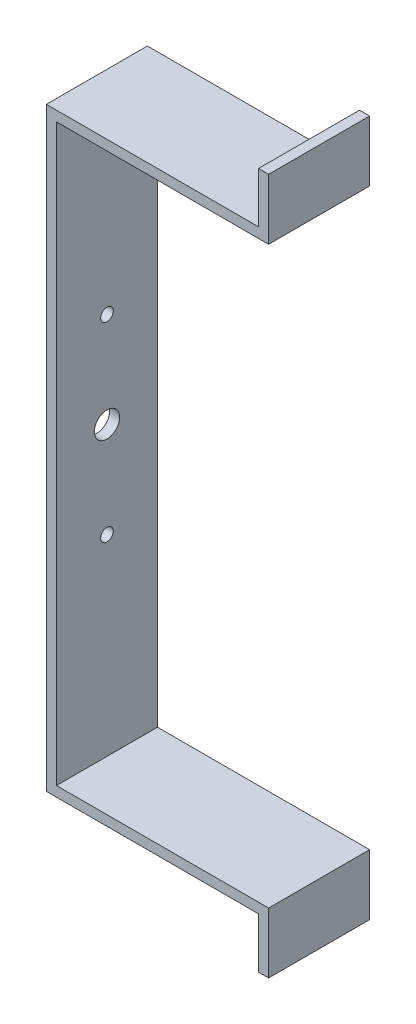
ISO-10303-21;
HEADER;
FILE_DESCRIPTION(('STEP AP214'),'2;1');
FILE_NAME('part.step','',(''),(''),'','','');
FILE_SCHEMA(('AUTOMOTIVE_DESIGN { 1 0 10303 214 1 1 1 1 }'));
ENDSEC;
DATA;
#1=APPLICATION_CONTEXT('core data for automotive mechanical design processes');
#2=APPLICATION_PROTOCOL_DEFINITION('international standard','automotive_design',2000,#1);
#3=PRODUCT_CONTEXT('',#1,'mechanical');
#4=PRODUCT('Part','Part','',(#3));
#5=PRODUCT_RELATED_PRODUCT_CATEGORY('part','',(#4));
#6=PRODUCT_DEFINITION_FORMATION('','',#4);
#7=PRODUCT_DEFINITION_CONTEXT('part definition',#1,'design');
#8=PRODUCT_DEFINITION('design','',#6,#7);
#9=PRODUCT_DEFINITION_SHAPE('','',#8);
#10=(LENGTH_UNIT() NAMED_UNIT(*) SI_UNIT(.MILLI.,.METRE.));
#11=(NAMED_UNIT(*) PLANE_ANGLE_UNIT() SI_UNIT($,.RADIAN.));
#12=(NAMED_UNIT(*) SI_UNIT($,.STERADIAN.) SOLID_ANGLE_UNIT());
#13=UNCERTAINTY_MEASURE_WITH_UNIT(LENGTH_MEASURE(1.E-05),#10,'distance_accuracy_value','');
#14=(GEOMETRIC_REPRESENTATION_CONTEXT(3) GLOBAL_UNCERTAINTY_ASSIGNED_CONTEXT((#13)) GLOBAL_UNIT_ASSIGNED_CONTEXT((#10,
#11,#12)) REPRESENTATION_CONTEXT('',''));
#15=CARTESIAN_POINT('',(0.,0.,0.));
#16=DIRECTION('',(0.,0.,1.));
#17=DIRECTION('',(1.,0.,0.));
#18=AXIS2_PLACEMENT_3D('',#15,#16,#17);
#19=CARTESIAN_POINT('',(53.34,-74.803,12.7));
#20=DIRECTION('',(1.,0.,0.));
#21=DIRECTION('',(0.,1.,0.));
#22=AXIS2_PLACEMENT_3D('',#19,#20,#21);
#23=PLANE('',#22);
#24=DIRECTION('',(0.,-1.,0.));
#25=VECTOR('',#24,1.);
#26=CARTESIAN_POINT('',(53.34,-74.803,-12.7));
#27=LINE('',#26,#25);
#28=CARTESIAN_POINT('',(53.34,-74.803,-12.7));
#29=VERTEX_POINT('',#28);
#30=CARTESIAN_POINT('',(53.34,-87.503,-12.7));
#31=VERTEX_POINT('',#30);
#32=EDGE_CURVE('E152',#29,#31,#27,.T.);
#33=ORIENTED_EDGE('',*,*,#32,.T.);
#34=DIRECTION('',(0.,0.,-1.));
#35=VECTOR('',#34,1.);
#36=CARTESIAN_POINT('',(53.34,-87.503,12.7));
#37=LINE('',#36,#35);
#38=CARTESIAN_POINT('',(53.34,-87.503,12.7));
#39=VERTEX_POINT('',#38);
#40=EDGE_CURVE('E11',#39,#31,#37,.T.);
#41=ORIENTED_EDGE('',*,*,#40,.F.);
#42=DIRECTION('',(0.,-1.,0.));
#43=VECTOR('',#42,1.);
#44=CARTESIAN_POINT('',(53.34,-74.803,12.7));
#45=LINE('',#44,#43);
#46=CARTESIAN_POINT('',(53.34,-74.803,12.7));
#47=VERTEX_POINT('',#46);
#48=EDGE_CURVE('E100',#47,#39,#45,.T.);
#49=ORIENTED_EDGE('',*,*,#48,.F.);
#50=DIRECTION('',(0.,0.,-1.));
#51=VECTOR('',#50,1.);
#52=CARTESIAN_POINT('',(53.34,-74.803,12.7));
#53=LINE('',#52,#51);
#54=EDGE_CURVE('E148',#47,#29,#53,.T.);
#55=ORIENTED_EDGE('',*,*,#54,.T.);
#56=EDGE_LOOP('',(#33,#41,#49,#55));
#57=FACE_BOUND('',#56,.T.);
#58=ADVANCED_FACE('F32',(#57),#23,.F.);
#59=CARTESIAN_POINT('',(55.88,-87.503,12.7));
#60=DIRECTION('',(0.,-1.,0.));
#61=DIRECTION('',(0.,0.,-1.));
#62=AXIS2_PLACEMENT_3D('',#59,#60,#61);
#63=PLANE('',#62);
#64=DIRECTION('',(-1.,0.,0.));
#65=VECTOR('',#64,1.);
#66=CARTESIAN_POINT('',(55.88,-87.503,-12.7));
#67=LINE('',#66,#65);
#68=CARTESIAN_POINT('',(55.88,-87.503,-12.7));
#69=VERTEX_POINT('',#68);
#70=EDGE_CURVE('E155',#69,#31,#67,.T.);
#71=ORIENTED_EDGE('',*,*,#70,.F.);
#72=DIRECTION('',(0.,0.,-1.));
#73=VECTOR('',#72,1.);
#74=CARTESIAN_POINT('',(55.88,-87.503,12.7));
#75=LINE('',#74,#73);
#76=CARTESIAN_POINT('',(55.88,-87.503,12.7));
#77=VERTEX_POINT('',#76);
#78=EDGE_CURVE('E40',#77,#69,#75,.T.);
#79=ORIENTED_EDGE('',*,*,#78,.F.);
#80=DIRECTION('',(-1.,0.,0.));
#81=VECTOR('',#80,1.);
#82=CARTESIAN_POINT('',(55.88,-87.503,12.7));
#83=LINE('',#82,#81);
#84=EDGE_CURVE('E218',#77,#39,#83,.T.);
#85=ORIENTED_EDGE('',*,*,#84,.T.);
#86=ORIENTED_EDGE('',*,*,#40,.T.);
#87=EDGE_LOOP('',(#71,#79,#85,#86));
#88=FACE_BOUND('',#87,.T.);
#89=ADVANCED_FACE('F205',(#88),#63,.T.);
#90=CARTESIAN_POINT('',(55.88,-74.803,12.7));
#91=DIRECTION('',(1.,0.,0.));
#92=DIRECTION('',(0.,1.,0.));
#93=AXIS2_PLACEMENT_3D('',#90,#91,#92);
#94=PLANE('',#93);
#95=DIRECTION('',(0.,-1.,0.));
#96=VECTOR('',#95,1.);
#97=CARTESIAN_POINT('',(55.88,-74.803,-12.7));
#98=LINE('',#97,#96);
#99=CARTESIAN_POINT('',(55.88,-72.263,-12.7));
#100=VERTEX_POINT('',#99);
#101=EDGE_CURVE('E159',#100,#69,#98,.T.);
#102=ORIENTED_EDGE('',*,*,#101,.F.);
#103=DIRECTION('',(0.,0.,-1.));
#104=VECTOR('',#103,1.);
#105=CARTESIAN_POINT('',(55.88,-72.263,12.7));
#106=LINE('',#105,#104);
#107=CARTESIAN_POINT('',(55.88,-72.263,12.7));
#108=VERTEX_POINT('',#107);
#109=EDGE_CURVE('E195',#108,#100,#106,.T.);
#110=ORIENTED_EDGE('',*,*,#109,.F.);
#111=DIRECTION('',(0.,-1.,0.));
#112=VECTOR('',#111,1.);
#113=CARTESIAN_POINT('',(55.88,-74.803,12.7));
#114=LINE('',#113,#112);
#115=EDGE_CURVE('E202',#108,#77,#114,.T.);
#116=ORIENTED_EDGE('',*,*,#115,.T.);
#117=ORIENTED_EDGE('',*,*,#78,.T.);
#118=EDGE_LOOP('',(#102,#110,#116,#117));
#119=FACE_BOUND('',#118,.T.);
#120=ADVANCED_FACE('F200',(#119),#94,.T.);
#121=CARTESIAN_POINT('',(0.,-72.263,12.7));
#122=DIRECTION('',(0.,1.,0.));
#123=DIRECTION('',(0.,0.,1.));
#124=AXIS2_PLACEMENT_3D('',#121,#122,#123);
#125=PLANE('',#124);
#126=DIRECTION('',(1.,0.,0.));
#127=VECTOR('',#126,1.);
#128=CARTESIAN_POINT('',(0.,-72.263,-12.7));
#129=LINE('',#128,#127);
#130=CARTESIAN_POINT('',(2.54000000000003,-72.263,-12.7));
#131=VERTEX_POINT('',#130);
#132=EDGE_CURVE('E162',#131,#100,#129,.T.);
#133=ORIENTED_EDGE('',*,*,#132,.F.);
#134=DIRECTION('',(0.,0.,-1.));
#135=VECTOR('',#134,1.);
#136=CARTESIAN_POINT('',(2.54000000000003,-72.263,12.7));
#137=LINE('',#136,#135);
#138=CARTESIAN_POINT('',(2.54000000000003,-72.263,12.7));
#139=VERTEX_POINT('',#138);
#140=EDGE_CURVE('E193',#139,#131,#137,.T.);
#141=ORIENTED_EDGE('',*,*,#140,.F.);
#142=DIRECTION('',(1.,0.,0.));
#143=VECTOR('',#142,1.);
#144=CARTESIAN_POINT('',(0.,-72.263,12.7));
#145=LINE('',#144,#143);
#146=EDGE_CURVE('E215',#139,#108,#145,.T.);
#147=ORIENTED_EDGE('',*,*,#146,.T.);
#148=ORIENTED_EDGE('',*,*,#109,.T.);
#149=EDGE_LOOP('',(#133,#141,#147,#148));
#150=FACE_BOUND('',#149,.T.);
#151=ADVANCED_FACE('F212',(#150),#125,.T.);
#152=CARTESIAN_POINT('',(2.54,74.803,12.7));
#153=DIRECTION('',(1.,0.,0.));
#154=DIRECTION('',(0.,1.,0.));
#155=AXIS2_PLACEMENT_3D('',#152,#153,#154);
#156=PLANE('',#155);
#157=CARTESIAN_POINT('',(2.54000000000002,-23.9776,0.));
#158=DIRECTION('',(1.,0.,0.));
#159=DIRECTION('',(0.,1.,0.));
#160=AXIS2_PLACEMENT_3D('',#157,#158,#159);
#161=CIRCLE('',#160,1.58749862500002);
#162=CARTESIAN_POINT('',(2.54000000000002,-25.565098625,0.));
#163=VERTEX_POINT('',#162);
#164=EDGE_CURVE('E288',#163,#163,#161,.T.);
#165=ORIENTED_EDGE('',*,*,#164,.F.);
#166=EDGE_LOOP('',(#165));
#167=FACE_BOUND('',#166,.T.);
#168=CARTESIAN_POINT('',(2.54000000000001,23.9776,0.));
#169=DIRECTION('',(1.,0.,0.));
#170=DIRECTION('',(0.,1.,0.));
#171=AXIS2_PLACEMENT_3D('',#168,#169,#170);
#172=CIRCLE('',#171,1.58749862500001);
#173=CARTESIAN_POINT('',(2.54000000000001,25.565098625,0.));
#174=VERTEX_POINT('',#173);
#175=EDGE_CURVE('E298',#174,#174,#172,.T.);
#176=ORIENTED_EDGE('',*,*,#175,.F.);
#177=EDGE_LOOP('',(#176));
#178=FACE_BOUND('',#177,.T.);
#179=CARTESIAN_POINT('',(2.54000000000001,0.,0.));
#180=DIRECTION('',(1.,0.,0.));
#181=DIRECTION('',(0.,1.,0.));
#182=AXIS2_PLACEMENT_3D('',#179,#180,#181);
#183=CIRCLE('',#182,3.175);
#184=CARTESIAN_POINT('',(2.54000000000001,3.175,0.));
#185=VERTEX_POINT('',#184);
#186=EDGE_CURVE('E301',#185,#185,#183,.T.);
#187=ORIENTED_EDGE('',*,*,#186,.F.);
#188=EDGE_LOOP('',(#187));
#189=FACE_BOUND('',#188,.T.);
#190=DIRECTION('',(0.,-1.,0.));
#191=VECTOR('',#190,1.);
#192=CARTESIAN_POINT('',(2.54,74.803,-12.7));
#193=LINE('',#192,#191);
#194=CARTESIAN_POINT('',(2.54,72.263,-12.7));
#195=VERTEX_POINT('',#194);
#196=EDGE_CURVE('E165',#195,#131,#193,.T.);
#197=ORIENTED_EDGE('',*,*,#196,.F.);
#198=DIRECTION('',(0.,0.,-1.));
#199=VECTOR('',#198,1.);
#200=CARTESIAN_POINT('',(2.54,72.263,12.7));
#201=LINE('',#200,#199);
#202=CARTESIAN_POINT('',(2.54,72.263,12.7));
#203=VERTEX_POINT('',#202);
#204=EDGE_CURVE('E191',#203,#195,#201,.T.);
#205=ORIENTED_EDGE('',*,*,#204,.F.);
#206=DIRECTION('',(0.,-1.,0.));
#207=VECTOR('',#206,1.);
#208=CARTESIAN_POINT('',(2.54,74.803,12.7));
#209=LINE('',#208,#207);
#210=EDGE_CURVE('E220',#203,#139,#209,.T.);
#211=ORIENTED_EDGE('',*,*,#210,.T.);
#212=ORIENTED_EDGE('',*,*,#140,.T.);
#213=EDGE_LOOP('',(#197,#205,#211,#212));
#214=FACE_BOUND('',#213,.T.);
#215=ADVANCED_FACE('F308',(#167,#178,#189,#214),#156,.T.);
#216=CARTESIAN_POINT('',(53.34,72.263,12.7));
#217=DIRECTION('',(0.,-1.,0.));
#218=DIRECTION('',(0.,0.,-1.));
#219=AXIS2_PLACEMENT_3D('',#216,#217,#218);
#220=PLANE('',#219);
#221=DIRECTION('',(1.,0.,0.));
#222=VECTOR('',#221,1.);
#223=CARTESIAN_POINT('',(53.34,72.263,-12.7));
#224=LINE('',#223,#222);
#225=CARTESIAN_POINT('',(55.88,72.263,-12.7));
#226=VERTEX_POINT('',#225);
#227=EDGE_CURVE('E168',#226,#195,#224,.F.);
#228=ORIENTED_EDGE('',*,*,#227,.F.);
#229=DIRECTION('',(0.,0.,-1.));
#230=VECTOR('',#229,1.);
#231=CARTESIAN_POINT('',(55.88,72.263,12.7));
#232=LINE('',#231,#230);
#233=CARTESIAN_POINT('',(55.88,72.263,12.7));
#234=VERTEX_POINT('',#233);
#235=EDGE_CURVE('E189',#234,#226,#232,.T.);
#236=ORIENTED_EDGE('',*,*,#235,.F.);
#237=DIRECTION('',(1.,0.,0.));
#238=VECTOR('',#237,1.);
#239=CARTESIAN_POINT('',(53.34,72.263,12.7));
#240=LINE('',#239,#238);
#241=EDGE_CURVE('E226',#234,#203,#240,.F.);
#242=ORIENTED_EDGE('',*,*,#241,.T.);
#243=ORIENTED_EDGE('',*,*,#204,.T.);
#244=EDGE_LOOP('',(#228,#236,#242,#243));
#245=FACE_BOUND('',#244,.T.);
#246=ADVANCED_FACE('F311',(#245),#220,.T.);
#247=CARTESIAN_POINT('',(55.88,74.803,12.7));
#248=DIRECTION('',(1.,0.,0.));
#249=DIRECTION('',(0.,0.,-1.));
#250=AXIS2_PLACEMENT_3D('',#247,#248,#249);
#251=PLANE('',#250);
#252=DIRECTION('',(0.,1.,0.));
#253=VECTOR('',#252,1.);
#254=CARTESIAN_POINT('',(55.88,74.803,-12.7));
#255=LINE('',#254,#253);
#256=CARTESIAN_POINT('',(55.88,87.503,-12.7));
#257=VERTEX_POINT('',#256);
#258=EDGE_CURVE('E171',#257,#226,#255,.F.);
#259=ORIENTED_EDGE('',*,*,#258,.F.);
#260=DIRECTION('',(0.,0.,-1.));
#261=VECTOR('',#260,1.);
#262=CARTESIAN_POINT('',(55.88,87.503,12.7));
#263=LINE('',#262,#261);
#264=CARTESIAN_POINT('',(55.88,87.503,12.7));
#265=VERTEX_POINT('',#264);
#266=EDGE_CURVE('E187',#265,#257,#263,.T.);
#267=ORIENTED_EDGE('',*,*,#266,.F.);
#268=DIRECTION('',(0.,1.,0.));
#269=VECTOR('',#268,1.);
#270=CARTESIAN_POINT('',(55.88,74.803,12.7));
#271=LINE('',#270,#269);
#272=EDGE_CURVE('E229',#265,#234,#271,.F.);
#273=ORIENTED_EDGE('',*,*,#272,.T.);
#274=ORIENTED_EDGE('',*,*,#235,.T.);
#275=EDGE_LOOP('',(#259,#267,#273,#274));
#276=FACE_BOUND('',#275,.T.);
#277=ADVANCED_FACE('F241',(#276),#251,.T.);
#278=CARTESIAN_POINT('',(53.34,87.503,12.7));
#279=DIRECTION('',(0.,1.,0.));
#280=DIRECTION('',(0.,0.,1.));
#281=AXIS2_PLACEMENT_3D('',#278,#279,#280);
#282=PLANE('',#281);
#283=DIRECTION('',(1.,0.,0.));
#284=VECTOR('',#283,1.);
#285=CARTESIAN_POINT('',(53.34,87.503,-12.7));
#286=LINE('',#285,#284);
#287=CARTESIAN_POINT('',(53.34,87.503,-12.7));
#288=VERTEX_POINT('',#287);
#289=EDGE_CURVE('E174',#288,#257,#286,.T.);
#290=ORIENTED_EDGE('',*,*,#289,.F.);
#291=DIRECTION('',(0.,0.,-1.));
#292=VECTOR('',#291,1.);
#293=CARTESIAN_POINT('',(53.34,87.503,12.7));
#294=LINE('',#293,#292);
#295=CARTESIAN_POINT('',(53.34,87.503,12.7));
#296=VERTEX_POINT('',#295);
#297=EDGE_CURVE('E185',#296,#288,#294,.T.);
#298=ORIENTED_EDGE('',*,*,#297,.F.);
#299=DIRECTION('',(1.,0.,0.));
#300=VECTOR('',#299,1.);
#301=CARTESIAN_POINT('',(53.34,87.503,12.7));
#302=LINE('',#301,#300);
#303=EDGE_CURVE('E232',#296,#265,#302,.T.);
#304=ORIENTED_EDGE('',*,*,#303,.T.);
#305=ORIENTED_EDGE('',*,*,#266,.T.);
#306=EDGE_LOOP('',(#290,#298,#304,#305));
#307=FACE_BOUND('',#306,.T.);
#308=ADVANCED_FACE('F236',(#307),#282,.T.);
#309=CARTESIAN_POINT('',(53.34,74.803,12.7));
#310=DIRECTION('',(1.,0.,0.));
#311=DIRECTION('',(0.,0.,-1.));
#312=AXIS2_PLACEMENT_3D('',#309,#310,#311);
#313=PLANE('',#312);
#314=DIRECTION('',(0.,-1.,0.));
#315=VECTOR('',#314,1.);
#316=CARTESIAN_POINT('',(53.34,74.803,-12.7));
#317=LINE('',#316,#315);
#318=CARTESIAN_POINT('',(53.34,74.803,-12.7));
#319=VERTEX_POINT('',#318);
#320=EDGE_CURVE('E177',#288,#319,#317,.T.);
#321=ORIENTED_EDGE('',*,*,#320,.T.);
#322=DIRECTION('',(0.,0.,-1.));
#323=VECTOR('',#322,1.);
#324=CARTESIAN_POINT('',(53.34,74.803,12.7));
#325=LINE('',#324,#323);
#326=CARTESIAN_POINT('',(53.34,74.803,12.7));
#327=VERTEX_POINT('',#326);
#328=EDGE_CURVE('E143',#327,#319,#325,.T.);
#329=ORIENTED_EDGE('',*,*,#328,.F.);
#330=DIRECTION('',(0.,-1.,0.));
#331=VECTOR('',#330,1.);
#332=CARTESIAN_POINT('',(53.34,74.803,12.7));
#333=LINE('',#332,#331);
#334=EDGE_CURVE('E134',#296,#327,#333,.T.);
#335=ORIENTED_EDGE('',*,*,#334,.F.);
#336=ORIENTED_EDGE('',*,*,#297,.T.);
#337=EDGE_LOOP('',(#321,#329,#335,#336));
#338=FACE_BOUND('',#337,.T.);
#339=ADVANCED_FACE('F245',(#338),#313,.F.);
#340=CARTESIAN_POINT('',(53.34,74.803,12.7));
#341=DIRECTION('',(0.,-1.,0.));
#342=DIRECTION('',(0.,0.,-1.));
#343=AXIS2_PLACEMENT_3D('',#340,#341,#342);
#344=PLANE('',#343);
#345=DIRECTION('',(-1.,0.,0.));
#346=VECTOR('',#345,1.);
#347=CARTESIAN_POINT('',(53.34,74.803,-12.7));
#348=LINE('',#347,#346);
#349=CARTESIAN_POINT('',(0.,74.803,-12.7));
#350=VERTEX_POINT('',#349);
#351=EDGE_CURVE('E142',#319,#350,#348,.T.);
#352=ORIENTED_EDGE('',*,*,#351,.T.);
#353=DIRECTION('',(0.,0.,-1.));
#354=VECTOR('',#353,1.);
#355=CARTESIAN_POINT('',(0.,74.803,12.7));
#356=LINE('',#355,#354);
#357=CARTESIAN_POINT('',(0.,74.803,12.7));
#358=VERTEX_POINT('',#357);
#359=EDGE_CURVE('E139',#358,#350,#356,.T.);
#360=ORIENTED_EDGE('',*,*,#359,.F.);
#361=DIRECTION('',(-1.,0.,0.));
#362=VECTOR('',#361,1.);
#363=CARTESIAN_POINT('',(53.34,74.803,12.7));
#364=LINE('',#363,#362);
#365=EDGE_CURVE('E127',#327,#358,#364,.T.);
#366=ORIENTED_EDGE('',*,*,#365,.F.);
#367=ORIENTED_EDGE('',*,*,#328,.T.);
#368=EDGE_LOOP('',(#352,#360,#366,#367));
#369=FACE_BOUND('',#368,.T.);
#370=ADVANCED_FACE('F140',(#369),#344,.F.);
#371=CARTESIAN_POINT('',(0.,74.803,12.7));
#372=DIRECTION('',(1.,0.,0.));
#373=DIRECTION('',(0.,1.,0.));
#374=AXIS2_PLACEMENT_3D('',#371,#372,#373);
#375=PLANE('',#374);
#376=CARTESIAN_POINT('',(0.,-23.9776,0.));
#377=DIRECTION('',(-1.,0.,0.));
#378=DIRECTION('',(0.,-1.,0.));
#379=AXIS2_PLACEMENT_3D('',#376,#377,#378);
#380=CIRCLE('',#379,1.58749862500002);
#381=CARTESIAN_POINT('',(0.,-25.565098625,0.));
#382=VERTEX_POINT('',#381);
#383=EDGE_CURVE('E291',#382,#382,#380,.T.);
#384=ORIENTED_EDGE('',*,*,#383,.F.);
#385=EDGE_LOOP('',(#384));
#386=FACE_BOUND('',#385,.T.);
#387=CARTESIAN_POINT('',(0.,23.9776,0.));
#388=DIRECTION('',(-1.,0.,0.));
#389=DIRECTION('',(0.,-1.,0.));
#390=AXIS2_PLACEMENT_3D('',#387,#388,#389);
#391=CIRCLE('',#390,1.58749862500001);
#392=CARTESIAN_POINT('',(0.,22.390101375,0.));
#393=VERTEX_POINT('',#392);
#394=EDGE_CURVE('E293',#393,#393,#391,.T.);
#395=ORIENTED_EDGE('',*,*,#394,.F.);
#396=EDGE_LOOP('',(#395));
#397=FACE_BOUND('',#396,.T.);
#398=CARTESIAN_POINT('',(0.,0.,0.));
#399=DIRECTION('',(1.,0.,0.));
#400=DIRECTION('',(0.,1.,0.));
#401=AXIS2_PLACEMENT_3D('',#398,#399,#400);
#402=CIRCLE('',#401,3.175);
#403=CARTESIAN_POINT('',(0.,3.175,0.));
#404=VERTEX_POINT('',#403);
#405=EDGE_CURVE('E156',#404,#404,#402,.T.);
#406=ORIENTED_EDGE('',*,*,#405,.T.);
#407=EDGE_LOOP('',(#406));
#408=FACE_BOUND('',#407,.T.);
#409=DIRECTION('',(0.,-1.,0.));
#410=VECTOR('',#409,1.);
#411=CARTESIAN_POINT('',(0.,74.803,-12.7));
#412=LINE('',#411,#410);
#413=CARTESIAN_POINT('',(0.,-74.803,-12.7));
#414=VERTEX_POINT('',#413);
#415=EDGE_CURVE('E88',#350,#414,#412,.T.);
#416=ORIENTED_EDGE('',*,*,#415,.T.);
#417=DIRECTION('',(0.,0.,-1.));
#418=VECTOR('',#417,1.);
#419=CARTESIAN_POINT('',(0.,-74.803,12.7));
#420=LINE('',#419,#418);
#421=CARTESIAN_POINT('',(0.,-74.803,12.7));
#422=VERTEX_POINT('',#421);
#423=EDGE_CURVE('E144',#422,#414,#420,.T.);
#424=ORIENTED_EDGE('',*,*,#423,.F.);
#425=DIRECTION('',(0.,-1.,0.));
#426=VECTOR('',#425,1.);
#427=CARTESIAN_POINT('',(0.,74.803,12.7));
#428=LINE('',#427,#426);
#429=EDGE_CURVE('E131',#358,#422,#428,.T.);
#430=ORIENTED_EDGE('',*,*,#429,.F.);
#431=ORIENTED_EDGE('',*,*,#359,.T.);
#432=EDGE_LOOP('',(#416,#424,#430,#431));
#433=FACE_BOUND('',#432,.T.);
#434=ADVANCED_FACE('F146',(#386,#397,#408,#433),#375,.F.);
#435=CARTESIAN_POINT('',(0.,-74.803,12.7));
#436=DIRECTION('',(0.,1.,0.));
#437=DIRECTION('',(0.,0.,1.));
#438=AXIS2_PLACEMENT_3D('',#435,#436,#437);
#439=PLANE('',#438);
#440=DIRECTION('',(1.,0.,0.));
#441=VECTOR('',#440,1.);
#442=CARTESIAN_POINT('',(0.,-74.803,-12.7));
#443=LINE('',#442,#441);
#444=EDGE_CURVE('E94',#414,#29,#443,.T.);
#445=ORIENTED_EDGE('',*,*,#444,.T.);
#446=ORIENTED_EDGE('',*,*,#54,.F.);
#447=DIRECTION('',(1.,0.,0.));
#448=VECTOR('',#447,1.);
#449=CARTESIAN_POINT('',(0.,-74.803,12.7));
#450=LINE('',#449,#448);
#451=EDGE_CURVE('E48',#422,#47,#450,.T.);
#452=ORIENTED_EDGE('',*,*,#451,.F.);
#453=ORIENTED_EDGE('',*,*,#423,.T.);
#454=EDGE_LOOP('',(#445,#446,#452,#453));
#455=FACE_BOUND('',#454,.T.);
#456=ADVANCED_FACE('F259',(#455),#439,.F.);
#457=CARTESIAN_POINT('',(53.34,-87.503,12.7));
#458=DIRECTION('',(0.,0.,-1.));
#459=DIRECTION('',(-1.,0.,0.));
#460=AXIS2_PLACEMENT_3D('',#457,#458,#459);
#461=PLANE('',#460);
#462=ORIENTED_EDGE('',*,*,#48,.T.);
#463=ORIENTED_EDGE('',*,*,#84,.F.);
#464=ORIENTED_EDGE('',*,*,#115,.F.);
#465=ORIENTED_EDGE('',*,*,#146,.F.);
#466=ORIENTED_EDGE('',*,*,#210,.F.);
#467=ORIENTED_EDGE('',*,*,#241,.F.);
#468=ORIENTED_EDGE('',*,*,#272,.F.);
#469=ORIENTED_EDGE('',*,*,#303,.F.);
#470=ORIENTED_EDGE('',*,*,#334,.T.);
#471=ORIENTED_EDGE('',*,*,#365,.T.);
#472=ORIENTED_EDGE('',*,*,#429,.T.);
#473=ORIENTED_EDGE('',*,*,#451,.T.);
#474=EDGE_LOOP('',(#462,#463,#464,#465,#466,#467,#468,#469,#470,#471,#472,#473));
#475=FACE_BOUND('',#474,.T.);
#476=ADVANCED_FACE('F129',(#475),#461,.F.);
#477=CARTESIAN_POINT('',(53.34,-87.503,-12.7));
#478=DIRECTION('',(0.,0.,-1.));
#479=DIRECTION('',(-1.,0.,0.));
#480=AXIS2_PLACEMENT_3D('',#477,#478,#479);
#481=PLANE('',#480);
#482=ORIENTED_EDGE('',*,*,#32,.F.);
#483=ORIENTED_EDGE('',*,*,#444,.F.);
#484=ORIENTED_EDGE('',*,*,#415,.F.);
#485=ORIENTED_EDGE('',*,*,#351,.F.);
#486=ORIENTED_EDGE('',*,*,#320,.F.);
#487=ORIENTED_EDGE('',*,*,#289,.T.);
#488=ORIENTED_EDGE('',*,*,#258,.T.);
#489=ORIENTED_EDGE('',*,*,#227,.T.);
#490=ORIENTED_EDGE('',*,*,#196,.T.);
#491=ORIENTED_EDGE('',*,*,#132,.T.);
#492=ORIENTED_EDGE('',*,*,#101,.T.);
#493=ORIENTED_EDGE('',*,*,#70,.T.);
#494=EDGE_LOOP('',(#482,#483,#484,#485,#486,#487,#488,#489,#490,#491,#492,#493));
#495=FACE_BOUND('',#494,.T.);
#496=ADVANCED_FACE('F208',(#495),#481,.T.);
#497=CARTESIAN_POINT('',(0.,0.,0.));
#498=DIRECTION('',(1.,0.,0.));
#499=DIRECTION('',(0.,1.,0.));
#500=AXIS2_PLACEMENT_3D('',#497,#498,#499);
#501=CYLINDRICAL_SURFACE('',#500,3.175);
#502=ORIENTED_EDGE('',*,*,#405,.F.);
#503=EDGE_LOOP('',(#502));
#504=FACE_BOUND('',#503,.T.);
#505=ORIENTED_EDGE('',*,*,#186,.T.);
#506=EDGE_LOOP('',(#505));
#507=FACE_BOUND('',#506,.T.);
#508=ADVANCED_FACE('F271',(#504,#507),#501,.F.);
#509=CARTESIAN_POINT('',(55.88,23.9776,0.));
#510=DIRECTION('',(-1.,0.,0.));
#511=DIRECTION('',(0.,-1.,0.));
#512=AXIS2_PLACEMENT_3D('',#509,#510,#511);
#513=CYLINDRICAL_SURFACE('',#512,1.58749862500001);
#514=ORIENTED_EDGE('',*,*,#175,.T.);
#515=EDGE_LOOP('',(#514));
#516=FACE_BOUND('',#515,.T.);
#517=ORIENTED_EDGE('',*,*,#394,.T.);
#518=EDGE_LOOP('',(#517));
#519=FACE_BOUND('',#518,.T.);
#520=ADVANCED_FACE('F275',(#516,#519),#513,.F.);
#521=CARTESIAN_POINT('',(55.8800000000001,-23.9776,0.));
#522=DIRECTION('',(-1.,0.,0.));
#523=DIRECTION('',(0.,-1.,0.));
#524=AXIS2_PLACEMENT_3D('',#521,#522,#523);
#525=CYLINDRICAL_SURFACE('',#524,1.58749862500002);
#526=CARTESIAN_POINT('',(2.54000000000002,-25.565098625,0.));
#527=CARTESIAN_POINT('',(2.51354166666669,-25.565098625,0.));
#528=CARTESIAN_POINT('',(2.48708333333335,-25.565098625,0.));
#529=CARTESIAN_POINT('',(2.43416666666669,-25.565098625,0.));
#530=CARTESIAN_POINT('',(2.40770833333336,-25.565098625,0.));
#531=CARTESIAN_POINT('',(2.35479166666669,-25.565098625,0.));
#532=CARTESIAN_POINT('',(2.32833333333336,-25.565098625,0.));
#533=CARTESIAN_POINT('',(2.27541666666669,-25.565098625,0.));
#534=CARTESIAN_POINT('',(2.24895833333336,-25.565098625,0.));
#535=CARTESIAN_POINT('',(2.19604166666669,-25.565098625,0.));
#536=CARTESIAN_POINT('',(2.16958333333335,-25.565098625,0.));
#537=CARTESIAN_POINT('',(2.11666666666668,-25.565098625,0.));
#538=CARTESIAN_POINT('',(2.09020833333335,-25.565098625,0.));
#539=CARTESIAN_POINT('',(2.03729166666668,-25.565098625,0.));
#540=CARTESIAN_POINT('',(2.01083333333335,-25.565098625,0.));
#541=CARTESIAN_POINT('',(1.95791666666668,-25.565098625,0.));
#542=CARTESIAN_POINT('',(1.93145833333335,-25.565098625,0.));
#543=CARTESIAN_POINT('',(1.87854166666668,-25.565098625,0.));
#544=CARTESIAN_POINT('',(1.85208333333335,-25.565098625,0.));
#545=CARTESIAN_POINT('',(1.79916666666669,-25.565098625,0.));
#546=CARTESIAN_POINT('',(1.77270833333335,-25.565098625,0.));
#547=CARTESIAN_POINT('',(1.71979166666669,-25.565098625,0.));
#548=CARTESIAN_POINT('',(1.69333333333335,-25.565098625,0.));
#549=CARTESIAN_POINT('',(1.64041666666668,-25.565098625,0.));
#550=CARTESIAN_POINT('',(1.61395833333335,-25.565098625,0.));
#551=CARTESIAN_POINT('',(1.56104166666668,-25.565098625,0.));
#552=CARTESIAN_POINT('',(1.53458333333335,-25.565098625,0.));
#553=CARTESIAN_POINT('',(1.48166666666668,-25.565098625,0.));
#554=CARTESIAN_POINT('',(1.45520833333335,-25.565098625,0.));
#555=CARTESIAN_POINT('',(1.40229166666668,-25.565098625,0.));
#556=CARTESIAN_POINT('',(1.37583333333335,-25.565098625,0.));
#557=CARTESIAN_POINT('',(1.32291666666668,-25.565098625,0.));
#558=CARTESIAN_POINT('',(1.29645833333335,-25.565098625,0.));
#559=CARTESIAN_POINT('',(1.24354166666668,-25.565098625,0.));
#560=CARTESIAN_POINT('',(1.21708333333335,-25.565098625,0.));
#561=CARTESIAN_POINT('',(1.16416666666668,-25.565098625,0.));
#562=CARTESIAN_POINT('',(1.13770833333335,-25.565098625,0.));
#563=CARTESIAN_POINT('',(1.08479166666668,-25.565098625,0.));
#564=CARTESIAN_POINT('',(1.05833333333335,-25.565098625,0.));
#565=CARTESIAN_POINT('',(1.00541666666668,-25.565098625,0.));
#566=CARTESIAN_POINT('',(0.978958333333349,-25.565098625,0.));
#567=CARTESIAN_POINT('',(0.92604166666668,-25.565098625,0.));
#568=CARTESIAN_POINT('',(0.899583333333345,-25.565098625,0.));
#569=CARTESIAN_POINT('',(0.846666666666676,-25.565098625,0.));
#570=CARTESIAN_POINT('',(0.820208333333343,-25.565098625,0.));
#571=CARTESIAN_POINT('',(0.767291666666676,-25.565098625,0.));
#572=CARTESIAN_POINT('',(0.740833333333343,-25.565098625,0.));
#573=CARTESIAN_POINT('',(0.687916666666677,-25.565098625,0.));
#574=CARTESIAN_POINT('',(0.661458333333344,-25.565098625,0.));
#575=CARTESIAN_POINT('',(0.608541666666677,-25.565098625,0.));
#576=CARTESIAN_POINT('',(0.582083333333344,-25.565098625,0.));
#577=CARTESIAN_POINT('',(0.529166666666678,-25.565098625,0.));
#578=CARTESIAN_POINT('',(0.502708333333345,-25.565098625,0.));
#579=CARTESIAN_POINT('',(0.449791666666678,-25.565098625,0.));
#580=CARTESIAN_POINT('',(0.423333333333345,-25.565098625,0.));
#581=CARTESIAN_POINT('',(0.370416666666676,-25.565098625,0.));
#582=CARTESIAN_POINT('',(0.343958333333341,-25.565098625,0.));
#583=CARTESIAN_POINT('',(0.291041666666672,-25.565098625,0.));
#584=CARTESIAN_POINT('',(0.264583333333339,-25.565098625,0.));
#585=CARTESIAN_POINT('',(0.211666666666672,-25.565098625,0.));
#586=CARTESIAN_POINT('',(0.185208333333339,-25.565098625,0.));
#587=CARTESIAN_POINT('',(0.132291666666673,-25.565098625,0.));
#588=CARTESIAN_POINT('',(0.10583333333334,-25.565098625,0.));
#589=CARTESIAN_POINT('',(0.0529166666666733,-25.565098625,0.));
#590=CARTESIAN_POINT('',(0.0264583333333401,-25.565098625,0.));
#591=CARTESIAN_POINT('',(0.,-25.565098625,0.));
#592=B_SPLINE_CURVE_WITH_KNOTS('',3,(#526,#527,#528,#529,#530,#531,#532,#533,#534,#535,#536,
#537,#538,#539,#540,#541,#542,#543,#544,#545,#546,#547,#548,#549,#550,#551,#552,#553,#554,#555,
#556,#557,#558,#559,#560,#561,#562,#563,#564,#565,#566,#567,#568,#569,#570,#571,#572,#573,#574,
#575,#576,#577,#578,#579,#580,#581,#582,#583,#584,#585,#586,#587,#588,#589,#590,#591),
.UNSPECIFIED.,.F.,.F.,(4,2,2,2,2,2,2,2,2,2,2,2,2,2,2,2,2,2,2,2,2,2,2,2,2,2,2,2,2,2,2,2,4),(0.,
0.0793749999999996,0.158749999999999,0.238124999999999,0.317499999999998,0.396875000000005,
0.476250000000004,0.555625000000004,0.635000000000004,0.714375000000003,0.793750000000003,
0.873125000000002,0.952500000000009,1.03187500000001,1.11125000000001,1.19062500000001,
1.27000000000001,1.34937500000001,1.42875000000001,1.50812500000001,1.58750000000001,
1.66687500000001,1.74625000000001,1.82562500000001,1.90500000000001,1.98437500000001,
2.06375000000001,2.14312500000001,2.22250000000002,2.30187500000002,2.38125000000002,
2.46062500000001,2.54000000000001),.UNSPECIFIED.);
#593=EDGE_CURVE('BSEAM279',#163,#382,#592,.T.);
#594=ORIENTED_EDGE('',*,*,#164,.T.);
#595=ORIENTED_EDGE('',*,*,#383,.T.);
#596=ORIENTED_EDGE('',*,*,#593,.T.);
#597=ORIENTED_EDGE('',*,*,#593,.F.);
#598=EDGE_LOOP('',(#594,#596,#595,#597));
#599=FACE_BOUND('',#598,.T.);
#600=ADVANCED_FACE('F279',(#599),#525,.F.);
#601=CLOSED_SHELL('',(#58,#89,#120,#151,#215,#246,#277,#308,#339,#370,#434,#456,#476,#496,#508,
#520,#600));
#602=MANIFOLD_SOLID_BREP('B2',#601);
#603=ADVANCED_BREP_SHAPE_REPRESENTATION('',(#18,#602),#14);
#604=SHAPE_DEFINITION_REPRESENTATION(#9,#603);
ENDSEC;
END-ISO-10303-21;
